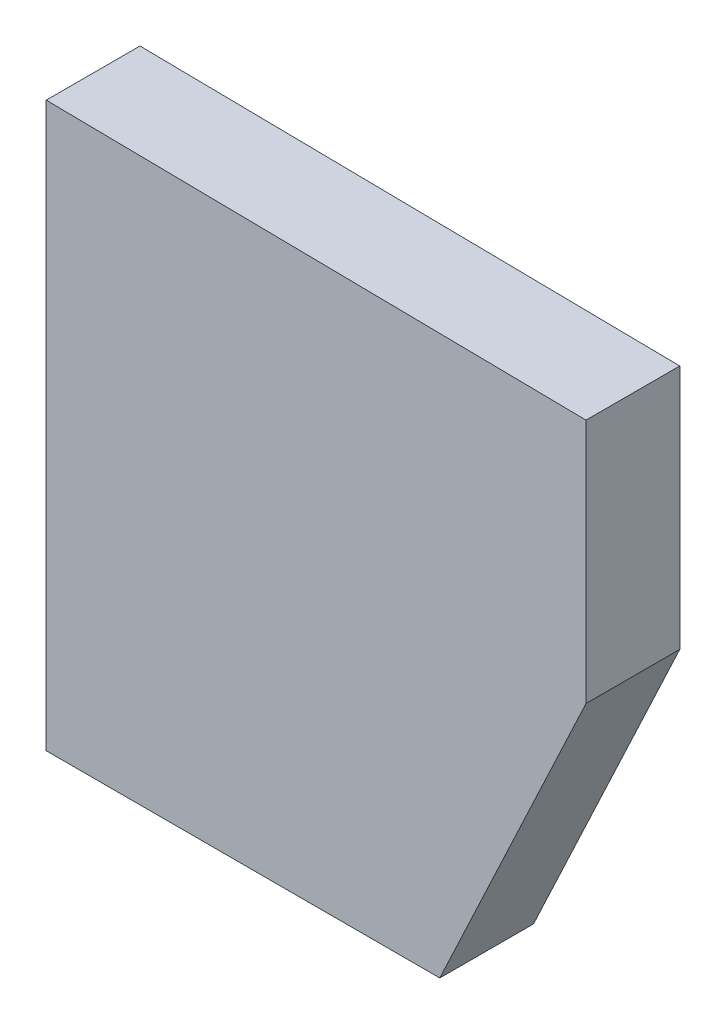
ISO-10303-21;
HEADER;
FILE_DESCRIPTION(('STEP AP214'),'2;1');
FILE_NAME('part.step','',(''),(''),'','','');
FILE_SCHEMA(('AUTOMOTIVE_DESIGN { 1 0 10303 214 1 1 1 1 }'));
ENDSEC;
DATA;
#1=APPLICATION_CONTEXT('core data for automotive mechanical design processes');
#2=APPLICATION_PROTOCOL_DEFINITION('international standard','automotive_design',2000,#1);
#3=PRODUCT_CONTEXT('',#1,'mechanical');
#4=PRODUCT('Part','Part','',(#3));
#5=PRODUCT_RELATED_PRODUCT_CATEGORY('part','',(#4));
#6=PRODUCT_DEFINITION_FORMATION('','',#4);
#7=PRODUCT_DEFINITION_CONTEXT('part definition',#1,'design');
#8=PRODUCT_DEFINITION('design','',#6,#7);
#9=PRODUCT_DEFINITION_SHAPE('','',#8);
#10=(LENGTH_UNIT() NAMED_UNIT(*) SI_UNIT(.MILLI.,.METRE.));
#11=(NAMED_UNIT(*) PLANE_ANGLE_UNIT() SI_UNIT($,.RADIAN.));
#12=(NAMED_UNIT(*) SI_UNIT($,.STERADIAN.) SOLID_ANGLE_UNIT());
#13=UNCERTAINTY_MEASURE_WITH_UNIT(LENGTH_MEASURE(1.E-05),#10,'distance_accuracy_value','');
#14=(GEOMETRIC_REPRESENTATION_CONTEXT(3) GLOBAL_UNCERTAINTY_ASSIGNED_CONTEXT((#13)) GLOBAL_UNIT_ASSIGNED_CONTEXT((#10,
#11,#12)) REPRESENTATION_CONTEXT('',''));
#15=CARTESIAN_POINT('',(0.,0.,0.));
#16=DIRECTION('',(0.,0.,1.));
#17=DIRECTION('',(1.,0.,0.));
#18=AXIS2_PLACEMENT_3D('',#15,#16,#17);
#19=CARTESIAN_POINT('',(0.,0.,3.));
#20=DIRECTION('',(0.,0.,-1.));
#21=DIRECTION('',(-1.,0.,0.));
#22=AXIS2_PLACEMENT_3D('',#19,#20,#21);
#23=PLANE('',#22);
#24=DIRECTION('',(0.,-1.,0.));
#25=VECTOR('',#24,1.);
#26=CARTESIAN_POINT('',(-2.,2.02695238519911,3.));
#27=LINE('',#26,#25);
#28=CARTESIAN_POINT('',(-2.,2.02695238519911,3.));
#29=VERTEX_POINT('',#28);
#30=CARTESIAN_POINT('',(-2.,-97.1481541650527,3.));
#31=VERTEX_POINT('',#30);
#32=EDGE_CURVE('E145',#29,#31,#27,.T.);
#33=ORIENTED_EDGE('',*,*,#32,.T.);
#34=DIRECTION('',(1.,0.,0.));
#35=VECTOR('',#34,1.);
#36=CARTESIAN_POINT('',(-2.,-97.1481541650527,3.));
#37=LINE('',#36,#35);
#38=CARTESIAN_POINT('',(67.2694465552627,-97.1481541650527,3.));
#39=VERTEX_POINT('',#38);
#40=EDGE_CURVE('E172',#31,#39,#37,.T.);
#41=ORIENTED_EDGE('',*,*,#40,.T.);
#42=DIRECTION('',(0.425645150184364,0.904890162464224,0.));
#43=VECTOR('',#42,1.);
#44=CARTESIAN_POINT('',(67.2694465552627,-97.1481541650527,3.));
#45=LINE('',#44,#43);
#46=CARTESIAN_POINT('',(93.,-42.4468973157316,3.));
#47=VERTEX_POINT('',#46);
#48=EDGE_CURVE('E175',#39,#47,#45,.T.);
#49=ORIENTED_EDGE('',*,*,#48,.T.);
#50=DIRECTION('',(0.,1.,0.));
#51=VECTOR('',#50,1.);
#52=CARTESIAN_POINT('',(93.,-42.4468973157316,3.));
#53=LINE('',#52,#51);
#54=CARTESIAN_POINT('',(93.,0.755225752348274,3.));
#55=VERTEX_POINT('',#54);
#56=EDGE_CURVE('E178',#47,#55,#53,.T.);
#57=ORIENTED_EDGE('',*,*,#56,.T.);
#58=DIRECTION('',(-0.999910411562526,0.0133853968510411,0.));
#59=VECTOR('',#58,1.);
#60=CARTESIAN_POINT('',(93.,0.755225752348274,3.));
#61=LINE('',#60,#59);
#62=EDGE_CURVE('E157',#55,#29,#61,.T.);
#63=ORIENTED_EDGE('',*,*,#62,.T.);
#64=EDGE_LOOP('',(#33,#41,#49,#57,#63));
#65=FACE_BOUND('',#64,.T.);
#66=ADVANCED_FACE('F40',(#65),#23,.F.);
#67=CARTESIAN_POINT('',(-2.,2.02695238519911,-13.5));
#68=DIRECTION('',(-1.,0.,0.));
#69=DIRECTION('',(0.,0.,1.));
#70=AXIS2_PLACEMENT_3D('',#67,#68,#69);
#71=PLANE('',#70);
#72=ORIENTED_EDGE('',*,*,#32,.F.);
#73=DIRECTION('',(0.,0.,1.));
#74=VECTOR('',#73,1.);
#75=CARTESIAN_POINT('',(-2.,2.02695238519911,-13.5));
#76=LINE('',#75,#74);
#77=CARTESIAN_POINT('',(-2.,2.02695238519911,-13.5));
#78=VERTEX_POINT('',#77);
#79=EDGE_CURVE('E183',#78,#29,#76,.T.);
#80=ORIENTED_EDGE('',*,*,#79,.F.);
#81=DIRECTION('',(0.,-1.,0.));
#82=VECTOR('',#81,1.);
#83=CARTESIAN_POINT('',(-2.,2.02695238519911,-13.5));
#84=LINE('',#83,#82);
#85=CARTESIAN_POINT('',(-2.,-97.1481541650527,-13.5));
#86=VERTEX_POINT('',#85);
#87=EDGE_CURVE('E153',#78,#86,#84,.T.);
#88=ORIENTED_EDGE('',*,*,#87,.T.);
#89=DIRECTION('',(0.,0.,1.));
#90=VECTOR('',#89,1.);
#91=CARTESIAN_POINT('',(-2.,-97.1481541650527,-13.5));
#92=LINE('',#91,#90);
#93=EDGE_CURVE('E169',#86,#31,#92,.T.);
#94=ORIENTED_EDGE('',*,*,#93,.T.);
#95=EDGE_LOOP('',(#72,#80,#88,#94));
#96=FACE_BOUND('',#95,.T.);
#97=ADVANCED_FACE('F214',(#96),#71,.T.);
#98=CARTESIAN_POINT('',(93.,0.755225752348274,-13.5));
#99=DIRECTION('',(0.0133853968510411,0.999910411562526,0.));
#100=DIRECTION('',(-0.999910411562526,0.0133853968510411,0.));
#101=AXIS2_PLACEMENT_3D('',#98,#99,#100);
#102=PLANE('',#101);
#103=ORIENTED_EDGE('',*,*,#62,.F.);
#104=DIRECTION('',(0.,0.,1.));
#105=VECTOR('',#104,1.);
#106=CARTESIAN_POINT('',(93.,0.755225752348274,-13.5));
#107=LINE('',#106,#105);
#108=CARTESIAN_POINT('',(93.,0.755225752348274,-13.5));
#109=VERTEX_POINT('',#108);
#110=EDGE_CURVE('E185',#109,#55,#107,.T.);
#111=ORIENTED_EDGE('',*,*,#110,.F.);
#112=DIRECTION('',(-0.999910411562526,0.0133853968510411,0.));
#113=VECTOR('',#112,1.);
#114=CARTESIAN_POINT('',(93.,0.755225752348274,-13.5));
#115=LINE('',#114,#113);
#116=EDGE_CURVE('E166',#109,#78,#115,.T.);
#117=ORIENTED_EDGE('',*,*,#116,.T.);
#118=ORIENTED_EDGE('',*,*,#79,.T.);
#119=EDGE_LOOP('',(#103,#111,#117,#118));
#120=FACE_BOUND('',#119,.T.);
#121=ADVANCED_FACE('F219',(#120),#102,.T.);
#122=CARTESIAN_POINT('',(93.,-42.4468973157316,-13.5));
#123=DIRECTION('',(1.,0.,0.));
#124=DIRECTION('',(0.,0.,-1.));
#125=AXIS2_PLACEMENT_3D('',#122,#123,#124);
#126=PLANE('',#125);
#127=ORIENTED_EDGE('',*,*,#56,.F.);
#128=DIRECTION('',(0.,0.,1.));
#129=VECTOR('',#128,1.);
#130=CARTESIAN_POINT('',(93.,-42.4468973157316,-13.5));
#131=LINE('',#130,#129);
#132=CARTESIAN_POINT('',(93.,-42.4468973157316,-13.5));
#133=VERTEX_POINT('',#132);
#134=EDGE_CURVE('E187',#133,#47,#131,.T.);
#135=ORIENTED_EDGE('',*,*,#134,.F.);
#136=DIRECTION('',(0.,1.,0.));
#137=VECTOR('',#136,1.);
#138=CARTESIAN_POINT('',(93.,-42.4468973157316,-13.5));
#139=LINE('',#138,#137);
#140=EDGE_CURVE('E163',#133,#109,#139,.T.);
#141=ORIENTED_EDGE('',*,*,#140,.T.);
#142=ORIENTED_EDGE('',*,*,#110,.T.);
#143=EDGE_LOOP('',(#127,#135,#141,#142));
#144=FACE_BOUND('',#143,.T.);
#145=ADVANCED_FACE('F230',(#144),#126,.T.);
#146=CARTESIAN_POINT('',(67.2694465552627,-97.1481541650527,-13.5));
#147=DIRECTION('',(0.904890162464224,-0.425645150184364,0.));
#148=DIRECTION('',(0.425645150184364,0.904890162464224,0.));
#149=AXIS2_PLACEMENT_3D('',#146,#147,#148);
#150=PLANE('',#149);
#151=ORIENTED_EDGE('',*,*,#48,.F.);
#152=DIRECTION('',(0.,0.,1.));
#153=VECTOR('',#152,1.);
#154=CARTESIAN_POINT('',(67.2694465552627,-97.1481541650527,-13.5));
#155=LINE('',#154,#153);
#156=CARTESIAN_POINT('',(67.2694465552627,-97.1481541650527,-13.5));
#157=VERTEX_POINT('',#156);
#158=EDGE_CURVE('E189',#157,#39,#155,.T.);
#159=ORIENTED_EDGE('',*,*,#158,.F.);
#160=DIRECTION('',(0.425645150184364,0.904890162464224,0.));
#161=VECTOR('',#160,1.);
#162=CARTESIAN_POINT('',(67.2694465552627,-97.1481541650527,-13.5));
#163=LINE('',#162,#161);
#164=EDGE_CURVE('E160',#157,#133,#163,.T.);
#165=ORIENTED_EDGE('',*,*,#164,.T.);
#166=ORIENTED_EDGE('',*,*,#134,.T.);
#167=EDGE_LOOP('',(#151,#159,#165,#166));
#168=FACE_BOUND('',#167,.T.);
#169=ADVANCED_FACE('F226',(#168),#150,.T.);
#170=CARTESIAN_POINT('',(-2.,-97.1481541650527,-13.5));
#171=DIRECTION('',(0.,-1.,0.));
#172=DIRECTION('',(0.,0.,-1.));
#173=AXIS2_PLACEMENT_3D('',#170,#171,#172);
#174=PLANE('',#173);
#175=ORIENTED_EDGE('',*,*,#40,.F.);
#176=ORIENTED_EDGE('',*,*,#93,.F.);
#177=DIRECTION('',(1.,0.,0.));
#178=VECTOR('',#177,1.);
#179=CARTESIAN_POINT('',(-2.,-97.1481541650527,-13.5));
#180=LINE('',#179,#178);
#181=EDGE_CURVE('E156',#86,#157,#180,.T.);
#182=ORIENTED_EDGE('',*,*,#181,.T.);
#183=ORIENTED_EDGE('',*,*,#158,.T.);
#184=EDGE_LOOP('',(#175,#176,#182,#183));
#185=FACE_BOUND('',#184,.T.);
#186=ADVANCED_FACE('F223',(#185),#174,.T.);
#187=CARTESIAN_POINT('',(0.,0.,-13.5));
#188=DIRECTION('',(0.,0.,1.));
#189=DIRECTION('',(1.,0.,0.));
#190=AXIS2_PLACEMENT_3D('',#187,#188,#189);
#191=PLANE('',#190);
#192=DIRECTION('',(0.,1.,0.));
#193=VECTOR('',#192,1.);
#194=CARTESIAN_POINT('',(91.,-42.,-13.5));
#195=LINE('',#194,#193);
#196=CARTESIAN_POINT('',(91.,-42.,-13.5));
#197=VERTEX_POINT('',#196);
#198=CARTESIAN_POINT('',(91.,-1.21818024830974,-13.5));
#199=VERTEX_POINT('',#198);
#200=EDGE_CURVE('E122',#197,#199,#195,.T.);
#201=ORIENTED_EDGE('',*,*,#200,.T.);
#202=DIRECTION('',(-0.999910411562526,0.0133853968510411,0.));
#203=VECTOR('',#202,1.);
#204=CARTESIAN_POINT('',(91.,-1.21818024830974,-13.5));
#205=LINE('',#204,#203);
#206=CARTESIAN_POINT('',(0.,0.,-13.5));
#207=VERTEX_POINT('',#206);
#208=EDGE_CURVE('E118',#199,#207,#205,.T.);
#209=ORIENTED_EDGE('',*,*,#208,.T.);
#210=DIRECTION('',(0.,-1.,0.));
#211=VECTOR('',#210,1.);
#212=CARTESIAN_POINT('',(0.,0.,-13.5));
#213=LINE('',#212,#211);
#214=CARTESIAN_POINT('',(0.,-95.1481541650527,-13.5));
#215=VERTEX_POINT('',#214);
#216=EDGE_CURVE('E126',#207,#215,#213,.T.);
#217=ORIENTED_EDGE('',*,*,#216,.T.);
#218=DIRECTION('',(1.,0.,0.));
#219=VECTOR('',#218,1.);
#220=CARTESIAN_POINT('',(0.,-95.1481541650527,-13.5));
#221=LINE('',#220,#219);
#222=CARTESIAN_POINT('',(66.,-95.1481541650526,-13.5));
#223=VERTEX_POINT('',#222);
#224=EDGE_CURVE('E131',#215,#223,#221,.T.);
#225=ORIENTED_EDGE('',*,*,#224,.T.);
#226=DIRECTION('',(0.425645150184364,0.904890162464224,0.));
#227=VECTOR('',#226,1.);
#228=CARTESIAN_POINT('',(66.,-95.1481541650526,-13.5));
#229=LINE('',#228,#227);
#230=EDGE_CURVE('E140',#223,#197,#229,.T.);
#231=ORIENTED_EDGE('',*,*,#230,.T.);
#232=EDGE_LOOP('',(#201,#209,#217,#225,#231));
#233=FACE_BOUND('',#232,.T.);
#234=ORIENTED_EDGE('',*,*,#87,.F.);
#235=ORIENTED_EDGE('',*,*,#116,.F.);
#236=ORIENTED_EDGE('',*,*,#140,.F.);
#237=ORIENTED_EDGE('',*,*,#164,.F.);
#238=ORIENTED_EDGE('',*,*,#181,.F.);
#239=EDGE_LOOP('',(#234,#235,#236,#237,#238));
#240=FACE_BOUND('',#239,.T.);
#241=ADVANCED_FACE('F133',(#233,#240),#191,.F.);
#242=CARTESIAN_POINT('',(91.,-1.21818024830974,-13.5));
#243=DIRECTION('',(0.0133853968510411,0.999910411562526,0.));
#244=DIRECTION('',(-0.999910411562526,0.0133853968510411,0.));
#245=AXIS2_PLACEMENT_3D('',#242,#243,#244);
#246=PLANE('',#245);
#247=DIRECTION('',(-0.999910411562526,0.0133853968510411,0.));
#248=VECTOR('',#247,1.);
#249=CARTESIAN_POINT('',(0.,0.,0.));
#250=LINE('',#249,#248);
#251=CARTESIAN_POINT('',(91.,-1.21818024830974,0.));
#252=VERTEX_POINT('',#251);
#253=CARTESIAN_POINT('',(0.,0.,0.));
#254=VERTEX_POINT('',#253);
#255=EDGE_CURVE('E11',#252,#254,#250,.T.);
#256=ORIENTED_EDGE('',*,*,#255,.T.);
#257=DIRECTION('',(0.,0.,1.));
#258=VECTOR('',#257,1.);
#259=CARTESIAN_POINT('',(0.,0.,-13.5));
#260=LINE('',#259,#258);
#261=EDGE_CURVE('E113',#207,#254,#260,.T.);
#262=ORIENTED_EDGE('',*,*,#261,.F.);
#263=ORIENTED_EDGE('',*,*,#208,.F.);
#264=DIRECTION('',(0.,0.,1.));
#265=VECTOR('',#264,1.);
#266=CARTESIAN_POINT('',(91.,-1.21818024830974,-13.5));
#267=LINE('',#266,#265);
#268=EDGE_CURVE('E143',#199,#252,#267,.T.);
#269=ORIENTED_EDGE('',*,*,#268,.T.);
#270=EDGE_LOOP('',(#256,#262,#263,#269));
#271=FACE_BOUND('',#270,.T.);
#272=ADVANCED_FACE('F115',(#271),#246,.F.);
#273=CARTESIAN_POINT('',(91.,-42.,-13.5));
#274=DIRECTION('',(1.,0.,0.));
#275=DIRECTION('',(0.,0.,-1.));
#276=AXIS2_PLACEMENT_3D('',#273,#274,#275);
#277=PLANE('',#276);
#278=DIRECTION('',(0.,1.,0.));
#279=VECTOR('',#278,1.);
#280=CARTESIAN_POINT('',(91.,-42.,0.));
#281=LINE('',#280,#279);
#282=CARTESIAN_POINT('',(91.,-42.,0.));
#283=VERTEX_POINT('',#282);
#284=EDGE_CURVE('E48',#283,#252,#281,.T.);
#285=ORIENTED_EDGE('',*,*,#284,.T.);
#286=ORIENTED_EDGE('',*,*,#268,.F.);
#287=ORIENTED_EDGE('',*,*,#200,.F.);
#288=DIRECTION('',(0.,0.,1.));
#289=VECTOR('',#288,1.);
#290=CARTESIAN_POINT('',(91.,-42.,-13.5));
#291=LINE('',#290,#289);
#292=EDGE_CURVE('E146',#197,#283,#291,.T.);
#293=ORIENTED_EDGE('',*,*,#292,.T.);
#294=EDGE_LOOP('',(#285,#286,#287,#293));
#295=FACE_BOUND('',#294,.T.);
#296=ADVANCED_FACE('F199',(#295),#277,.F.);
#297=CARTESIAN_POINT('',(66.,-95.1481541650526,-13.5));
#298=DIRECTION('',(0.904890162464224,-0.425645150184364,0.));
#299=DIRECTION('',(0.425645150184364,0.904890162464224,0.));
#300=AXIS2_PLACEMENT_3D('',#297,#298,#299);
#301=PLANE('',#300);
#302=DIRECTION('',(0.425645150184364,0.904890162464224,0.));
#303=VECTOR('',#302,1.);
#304=CARTESIAN_POINT('',(66.,-95.1481541650526,0.));
#305=LINE('',#304,#303);
#306=CARTESIAN_POINT('',(66.,-95.1481541650526,0.));
#307=VERTEX_POINT('',#306);
#308=EDGE_CURVE('E196',#307,#283,#305,.T.);
#309=ORIENTED_EDGE('',*,*,#308,.T.);
#310=ORIENTED_EDGE('',*,*,#292,.F.);
#311=ORIENTED_EDGE('',*,*,#230,.F.);
#312=DIRECTION('',(0.,0.,1.));
#313=VECTOR('',#312,1.);
#314=CARTESIAN_POINT('',(66.,-95.1481541650526,-13.5));
#315=LINE('',#314,#313);
#316=EDGE_CURVE('E149',#223,#307,#315,.T.);
#317=ORIENTED_EDGE('',*,*,#316,.T.);
#318=EDGE_LOOP('',(#309,#310,#311,#317));
#319=FACE_BOUND('',#318,.T.);
#320=ADVANCED_FACE('F201',(#319),#301,.F.);
#321=CARTESIAN_POINT('',(0.,-95.1481541650527,-13.5));
#322=DIRECTION('',(0.,-1.,0.));
#323=DIRECTION('',(1.,0.,0.));
#324=AXIS2_PLACEMENT_3D('',#321,#322,#323);
#325=PLANE('',#324);
#326=DIRECTION('',(1.,0.,0.));
#327=VECTOR('',#326,1.);
#328=CARTESIAN_POINT('',(66.,-95.1481541650526,0.));
#329=LINE('',#328,#327);
#330=CARTESIAN_POINT('',(0.,-95.1481541650527,0.));
#331=VERTEX_POINT('',#330);
#332=EDGE_CURVE('E193',#331,#307,#329,.T.);
#333=ORIENTED_EDGE('',*,*,#332,.T.);
#334=ORIENTED_EDGE('',*,*,#316,.F.);
#335=ORIENTED_EDGE('',*,*,#224,.F.);
#336=DIRECTION('',(0.,0.,1.));
#337=VECTOR('',#336,1.);
#338=CARTESIAN_POINT('',(0.,-95.1481541650527,-13.5));
#339=LINE('',#338,#337);
#340=EDGE_CURVE('E121',#215,#331,#339,.T.);
#341=ORIENTED_EDGE('',*,*,#340,.T.);
#342=EDGE_LOOP('',(#333,#334,#335,#341));
#343=FACE_BOUND('',#342,.T.);
#344=ADVANCED_FACE('F204',(#343),#325,.F.);
#345=CARTESIAN_POINT('',(0.,0.,-13.5));
#346=DIRECTION('',(-1.,0.,0.));
#347=DIRECTION('',(0.,-1.,0.));
#348=AXIS2_PLACEMENT_3D('',#345,#346,#347);
#349=PLANE('',#348);
#350=DIRECTION('',(0.,-1.,0.));
#351=VECTOR('',#350,1.);
#352=CARTESIAN_POINT('',(0.,-95.1481541650527,0.));
#353=LINE('',#352,#351);
#354=EDGE_CURVE('E55',#254,#331,#353,.T.);
#355=ORIENTED_EDGE('',*,*,#354,.T.);
#356=ORIENTED_EDGE('',*,*,#340,.F.);
#357=ORIENTED_EDGE('',*,*,#216,.F.);
#358=ORIENTED_EDGE('',*,*,#261,.T.);
#359=EDGE_LOOP('',(#355,#356,#357,#358));
#360=FACE_BOUND('',#359,.T.);
#361=ADVANCED_FACE('F127',(#360),#349,.F.);
#362=CARTESIAN_POINT('',(0.,0.,0.));
#363=DIRECTION('',(0.,0.,-1.));
#364=DIRECTION('',(-1.,0.,0.));
#365=AXIS2_PLACEMENT_3D('',#362,#363,#364);
#366=PLANE('',#365);
#367=ORIENTED_EDGE('',*,*,#354,.F.);
#368=ORIENTED_EDGE('',*,*,#255,.F.);
#369=ORIENTED_EDGE('',*,*,#284,.F.);
#370=ORIENTED_EDGE('',*,*,#308,.F.);
#371=ORIENTED_EDGE('',*,*,#332,.F.);
#372=EDGE_LOOP('',(#367,#368,#369,#370,#371));
#373=FACE_BOUND('',#372,.T.);
#374=ADVANCED_FACE('F42',(#373),#366,.T.);
#375=CLOSED_SHELL('',(#66,#97,#121,#145,#169,#186,#241,#272,#296,#320,#344,#361,#374));
#376=MANIFOLD_SOLID_BREP('B2',#375);
#377=ADVANCED_BREP_SHAPE_REPRESENTATION('',(#18,#376),#14);
#378=SHAPE_DEFINITION_REPRESENTATION(#9,#377);
ENDSEC;
END-ISO-10303-21;
